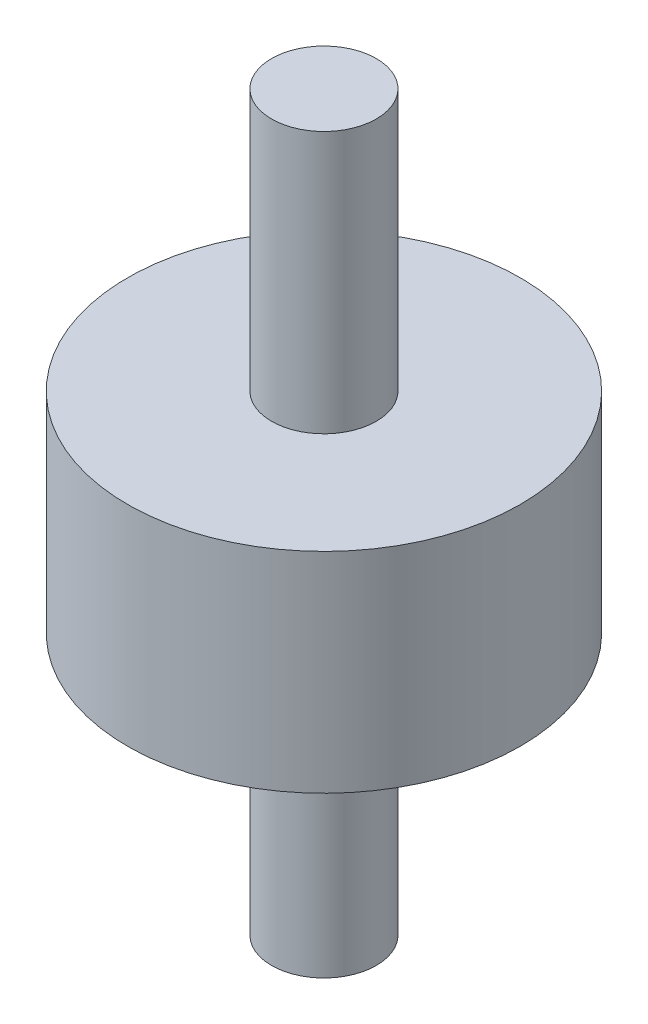
ISO-10303-21;
HEADER;
FILE_DESCRIPTION(('STEP AP214'),'2;1');
FILE_NAME('part.step','',(''),(''),'','','');
FILE_SCHEMA(('AUTOMOTIVE_DESIGN { 1 0 10303 214 1 1 1 1 }'));
ENDSEC;
DATA;
#1=APPLICATION_CONTEXT('core data for automotive mechanical design processes');
#2=APPLICATION_PROTOCOL_DEFINITION('international standard','automotive_design',2000,#1);
#3=PRODUCT_CONTEXT('',#1,'mechanical');
#4=PRODUCT('Part','Part','',(#3));
#5=PRODUCT_RELATED_PRODUCT_CATEGORY('part','',(#4));
#6=PRODUCT_DEFINITION_FORMATION('','',#4);
#7=PRODUCT_DEFINITION_CONTEXT('part definition',#1,'design');
#8=PRODUCT_DEFINITION('design','',#6,#7);
#9=PRODUCT_DEFINITION_SHAPE('','',#8);
#10=(LENGTH_UNIT() NAMED_UNIT(*) SI_UNIT(.MILLI.,.METRE.));
#11=(NAMED_UNIT(*) PLANE_ANGLE_UNIT() SI_UNIT($,.RADIAN.));
#12=(NAMED_UNIT(*) SI_UNIT($,.STERADIAN.) SOLID_ANGLE_UNIT());
#13=UNCERTAINTY_MEASURE_WITH_UNIT(LENGTH_MEASURE(1.E-05),#10,'distance_accuracy_value','');
#14=(GEOMETRIC_REPRESENTATION_CONTEXT(3) GLOBAL_UNCERTAINTY_ASSIGNED_CONTEXT((#13)) GLOBAL_UNIT_ASSIGNED_CONTEXT((#10,
#11,#12)) REPRESENTATION_CONTEXT('',''));
#15=CARTESIAN_POINT('',(0.,0.,0.));
#16=DIRECTION('',(0.,0.,1.));
#17=DIRECTION('',(1.,0.,0.));
#18=AXIS2_PLACEMENT_3D('',#15,#16,#17);
#19=CARTESIAN_POINT('',(0.,28.,0.));
#20=DIRECTION('',(0.,-1.,0.));
#21=DIRECTION('',(1.,0.,0.));
#22=AXIS2_PLACEMENT_3D('',#19,#20,#21);
#23=PLANE('',#22);
#24=CARTESIAN_POINT('',(0.,28.,0.));
#25=DIRECTION('',(0.,-1.,0.));
#26=DIRECTION('',(1.,0.,0.));
#27=AXIS2_PLACEMENT_3D('',#24,#25,#26);
#28=CIRCLE('',#27,2.);
#29=CARTESIAN_POINT('',(2.,28.,0.));
#30=VERTEX_POINT('',#29);
#31=EDGE_CURVE('E10',#30,#30,#28,.T.);
#32=ORIENTED_EDGE('',*,*,#31,.F.);
#33=EDGE_LOOP('',(#32));
#34=FACE_BOUND('',#33,.T.);
#35=ADVANCED_FACE('F39',(#34),#23,.F.);
#36=CARTESIAN_POINT('',(0.,0.,0.));
#37=DIRECTION('',(0.,-1.,0.));
#38=DIRECTION('',(1.,0.,0.));
#39=AXIS2_PLACEMENT_3D('',#36,#37,#38);
#40=CYLINDRICAL_SURFACE('',#39,2.);
#41=CARTESIAN_POINT('',(0.,18.,0.));
#42=DIRECTION('',(0.,-1.,0.));
#43=DIRECTION('',(1.,0.,0.));
#44=AXIS2_PLACEMENT_3D('',#41,#42,#43);
#45=CIRCLE('',#44,2.);
#46=CARTESIAN_POINT('',(2.,18.,0.));
#47=VERTEX_POINT('',#46);
#48=EDGE_CURVE('E46',#47,#47,#45,.T.);
#49=ORIENTED_EDGE('',*,*,#48,.F.);
#50=EDGE_LOOP('',(#49));
#51=FACE_BOUND('',#50,.T.);
#52=ORIENTED_EDGE('',*,*,#31,.T.);
#53=EDGE_LOOP('',(#52));
#54=FACE_BOUND('',#53,.T.);
#55=ADVANCED_FACE('F93',(#51,#54),#40,.T.);
#56=CARTESIAN_POINT('',(-1.99999999999999,18.,0.));
#57=DIRECTION('',(0.,-1.,0.));
#58=DIRECTION('',(1.,0.,0.));
#59=AXIS2_PLACEMENT_3D('',#56,#57,#58);
#60=PLANE('',#59);
#61=CARTESIAN_POINT('',(0.,18.,0.));
#62=DIRECTION('',(0.,-1.,0.));
#63=DIRECTION('',(1.,0.,0.));
#64=AXIS2_PLACEMENT_3D('',#61,#62,#63);
#65=CIRCLE('',#64,7.5);
#66=CARTESIAN_POINT('',(7.5,18.,0.));
#67=VERTEX_POINT('',#66);
#68=EDGE_CURVE('E51',#67,#67,#65,.T.);
#69=ORIENTED_EDGE('',*,*,#68,.F.);
#70=EDGE_LOOP('',(#69));
#71=FACE_BOUND('',#70,.T.);
#72=ORIENTED_EDGE('',*,*,#48,.T.);
#73=EDGE_LOOP('',(#72));
#74=FACE_BOUND('',#73,.T.);
#75=ADVANCED_FACE('F88',(#71,#74),#60,.F.);
#76=CARTESIAN_POINT('',(0.,0.,0.));
#77=DIRECTION('',(0.,-1.,0.));
#78=DIRECTION('',(1.,0.,0.));
#79=AXIS2_PLACEMENT_3D('',#76,#77,#78);
#80=CYLINDRICAL_SURFACE('',#79,7.5);
#81=CARTESIAN_POINT('',(0.,10.,0.));
#82=DIRECTION('',(0.,-1.,0.));
#83=DIRECTION('',(1.,0.,0.));
#84=AXIS2_PLACEMENT_3D('',#81,#82,#83);
#85=CIRCLE('',#84,7.5);
#86=CARTESIAN_POINT('',(7.5,10.,0.));
#87=VERTEX_POINT('',#86);
#88=EDGE_CURVE('E56',#87,#87,#85,.T.);
#89=ORIENTED_EDGE('',*,*,#88,.F.);
#90=EDGE_LOOP('',(#89));
#91=FACE_BOUND('',#90,.T.);
#92=ORIENTED_EDGE('',*,*,#68,.T.);
#93=EDGE_LOOP('',(#92));
#94=FACE_BOUND('',#93,.T.);
#95=ADVANCED_FACE('F82',(#91,#94),#80,.T.);
#96=CARTESIAN_POINT('',(-7.5,10.,0.));
#97=DIRECTION('',(0.,1.,0.));
#98=DIRECTION('',(-1.,0.,0.));
#99=AXIS2_PLACEMENT_3D('',#96,#97,#98);
#100=PLANE('',#99);
#101=CARTESIAN_POINT('',(0.,10.,0.));
#102=DIRECTION('',(0.,-1.,0.));
#103=DIRECTION('',(1.,0.,0.));
#104=AXIS2_PLACEMENT_3D('',#101,#102,#103);
#105=CIRCLE('',#104,1.99999999999999);
#106=CARTESIAN_POINT('',(1.99999999999999,10.,0.));
#107=VERTEX_POINT('',#106);
#108=EDGE_CURVE('E62',#107,#107,#105,.T.);
#109=ORIENTED_EDGE('',*,*,#108,.F.);
#110=EDGE_LOOP('',(#109));
#111=FACE_BOUND('',#110,.T.);
#112=ORIENTED_EDGE('',*,*,#88,.T.);
#113=EDGE_LOOP('',(#112));
#114=FACE_BOUND('',#113,.T.);
#115=ADVANCED_FACE('F76',(#111,#114),#100,.F.);
#116=CARTESIAN_POINT('',(0.,0.,0.));
#117=DIRECTION('',(0.,-1.,0.));
#118=DIRECTION('',(1.,0.,0.));
#119=AXIS2_PLACEMENT_3D('',#116,#117,#118);
#120=CYLINDRICAL_SURFACE('',#119,1.99999999999999);
#121=CARTESIAN_POINT('',(0.,0.,0.));
#122=DIRECTION('',(0.,-1.,0.));
#123=DIRECTION('',(1.,0.,0.));
#124=AXIS2_PLACEMENT_3D('',#121,#122,#123);
#125=CIRCLE('',#124,1.99999999999999);
#126=CARTESIAN_POINT('',(1.99999999999999,0.,0.));
#127=VERTEX_POINT('',#126);
#128=EDGE_CURVE('E66',#127,#127,#125,.T.);
#129=ORIENTED_EDGE('',*,*,#128,.F.);
#130=EDGE_LOOP('',(#129));
#131=FACE_BOUND('',#130,.T.);
#132=ORIENTED_EDGE('',*,*,#108,.T.);
#133=EDGE_LOOP('',(#132));
#134=FACE_BOUND('',#133,.T.);
#135=ADVANCED_FACE('F73',(#131,#134),#120,.T.);
#136=CARTESIAN_POINT('',(-1.99999999999999,0.,0.));
#137=DIRECTION('',(0.,1.,0.));
#138=DIRECTION('',(-1.,0.,0.));
#139=AXIS2_PLACEMENT_3D('',#136,#137,#138);
#140=PLANE('',#139);
#141=ORIENTED_EDGE('',*,*,#128,.T.);
#142=EDGE_LOOP('',(#141));
#143=FACE_BOUND('',#142,.T.);
#144=ADVANCED_FACE('F71',(#143),#140,.F.);
#145=CLOSED_SHELL('',(#35,#55,#75,#95,#115,#135,#144));
#146=MANIFOLD_SOLID_BREP('B2',#145);
#147=ADVANCED_BREP_SHAPE_REPRESENTATION('',(#18,#146),#14);
#148=SHAPE_DEFINITION_REPRESENTATION(#9,#147);
ENDSEC;
END-ISO-10303-21;
